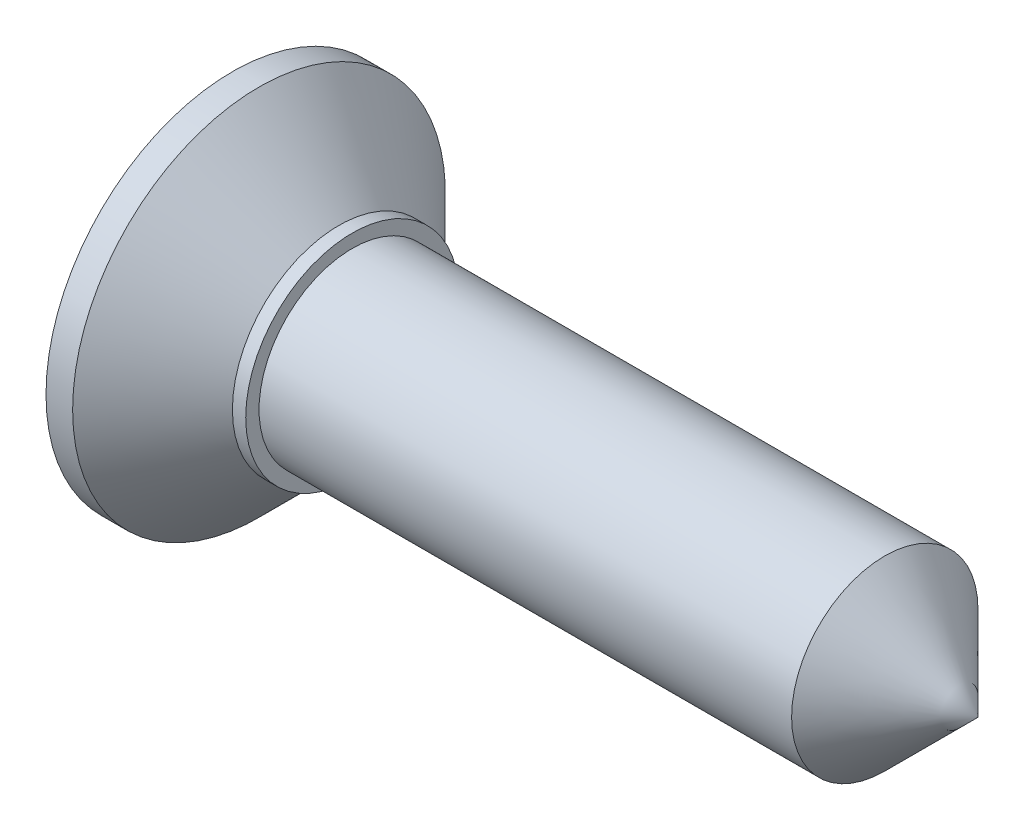
ISO-10303-21;
HEADER;
FILE_DESCRIPTION(('STEP AP214'),'2;1');
FILE_NAME('part.step','',(''),(''),'','','');
FILE_SCHEMA(('AUTOMOTIVE_DESIGN { 1 0 10303 214 1 1 1 1 }'));
ENDSEC;
DATA;
#1=APPLICATION_CONTEXT('core data for automotive mechanical design processes');
#2=APPLICATION_PROTOCOL_DEFINITION('international standard','automotive_design',2000,#1);
#3=PRODUCT_CONTEXT('',#1,'mechanical');
#4=PRODUCT('Part','Part','',(#3));
#5=PRODUCT_RELATED_PRODUCT_CATEGORY('part','',(#4));
#6=PRODUCT_DEFINITION_FORMATION('','',#4);
#7=PRODUCT_DEFINITION_CONTEXT('part definition',#1,'design');
#8=PRODUCT_DEFINITION('design','',#6,#7);
#9=PRODUCT_DEFINITION_SHAPE('','',#8);
#10=(LENGTH_UNIT() NAMED_UNIT(*) SI_UNIT(.MILLI.,.METRE.));
#11=(NAMED_UNIT(*) PLANE_ANGLE_UNIT() SI_UNIT($,.RADIAN.));
#12=(NAMED_UNIT(*) SI_UNIT($,.STERADIAN.) SOLID_ANGLE_UNIT());
#13=UNCERTAINTY_MEASURE_WITH_UNIT(LENGTH_MEASURE(1.E-05),#10,'distance_accuracy_value','');
#14=(GEOMETRIC_REPRESENTATION_CONTEXT(3) GLOBAL_UNCERTAINTY_ASSIGNED_CONTEXT((#13)) GLOBAL_UNIT_ASSIGNED_CONTEXT((#10,
#11,#12)) REPRESENTATION_CONTEXT('',''));
#15=CARTESIAN_POINT('',(0.,0.,0.));
#16=DIRECTION('',(0.,0.,1.));
#17=DIRECTION('',(1.,0.,0.));
#18=AXIS2_PLACEMENT_3D('',#15,#16,#17);
#19=CARTESIAN_POINT('',(2.25,2.,0.));
#20=DIRECTION('',(1.,0.,0.));
#21=DIRECTION('',(0.,0.,-1.));
#22=AXIS2_PLACEMENT_3D('',#19,#20,#21);
#23=PLANE('',#22);
#24=CARTESIAN_POINT('',(2.25,0.,0.));
#25=DIRECTION('',(-1.,0.,0.));
#26=DIRECTION('',(0.,0.,1.));
#27=AXIS2_PLACEMENT_3D('',#24,#25,#26);
#28=CIRCLE('',#27,2.);
#29=CARTESIAN_POINT('',(2.25,0.,2.));
#30=VERTEX_POINT('',#29);
#31=EDGE_CURVE('E11',#30,#30,#28,.T.);
#32=ORIENTED_EDGE('',*,*,#31,.F.);
#33=EDGE_LOOP('',(#32));
#34=FACE_BOUND('',#33,.T.);
#35=CARTESIAN_POINT('',(2.25,0.,0.));
#36=DIRECTION('',(1.,0.,0.));
#37=DIRECTION('',(0.,0.,-1.));
#38=AXIS2_PLACEMENT_3D('',#35,#36,#37);
#39=CIRCLE('',#38,1.75);
#40=CARTESIAN_POINT('',(2.25,0.,-1.75));
#41=VERTEX_POINT('',#40);
#42=EDGE_CURVE('E209',#41,#41,#39,.T.);
#43=ORIENTED_EDGE('',*,*,#42,.F.);
#44=EDGE_LOOP('',(#43));
#45=FACE_BOUND('',#44,.T.);
#46=ADVANCED_FACE('F34',(#34,#45),#23,.T.);
#47=CARTESIAN_POINT('',(2.25,0.,0.));
#48=DIRECTION('',(-1.,0.,0.));
#49=DIRECTION('',(0.,0.,1.));
#50=AXIS2_PLACEMENT_3D('',#47,#48,#49);
#51=CYLINDRICAL_SURFACE('',#50,2.);
#52=ORIENTED_EDGE('',*,*,#31,.T.);
#53=EDGE_LOOP('',(#52));
#54=FACE_BOUND('',#53,.T.);
#55=CARTESIAN_POINT('',(2.,0.,0.));
#56=DIRECTION('',(-1.,0.,0.));
#57=DIRECTION('',(0.,0.,1.));
#58=AXIS2_PLACEMENT_3D('',#55,#56,#57);
#59=CIRCLE('',#58,2.);
#60=CARTESIAN_POINT('',(2.,0.,2.));
#61=VERTEX_POINT('',#60);
#62=EDGE_CURVE('E243',#61,#61,#59,.T.);
#63=ORIENTED_EDGE('',*,*,#62,.F.);
#64=EDGE_LOOP('',(#63));
#65=FACE_BOUND('',#64,.T.);
#66=ADVANCED_FACE('F426',(#54,#65),#51,.T.);
#67=CARTESIAN_POINT('',(0.,0.,0.));
#68=DIRECTION('',(-1.,0.,0.));
#69=DIRECTION('',(0.,0.,1.));
#70=AXIS2_PLACEMENT_3D('',#67,#68,#69);
#71=PLANE('',#70);
#72=DIRECTION('',(0.,0.,1.));
#73=VECTOR('',#72,1.);
#74=CARTESIAN_POINT('',(0.,-0.43,-2.15));
#75=LINE('',#74,#73);
#76=CARTESIAN_POINT('',(0.,-0.43,-2.15));
#77=VERTEX_POINT('',#76);
#78=CARTESIAN_POINT('',(0.,-0.43,-0.605426386469648));
#79=VERTEX_POINT('',#78);
#80=EDGE_CURVE('E53',#77,#79,#75,.T.);
#81=ORIENTED_EDGE('',*,*,#80,.F.);
#82=DIRECTION('',(0.,-1.,0.));
#83=VECTOR('',#82,1.);
#84=CARTESIAN_POINT('',(0.,0.43,-2.15));
#85=LINE('',#84,#83);
#86=CARTESIAN_POINT('',(0.,0.43,-2.15));
#87=VERTEX_POINT('',#86);
#88=EDGE_CURVE('E182',#87,#77,#85,.T.);
#89=ORIENTED_EDGE('',*,*,#88,.F.);
#90=DIRECTION('',(0.,0.,-1.));
#91=VECTOR('',#90,1.);
#92=CARTESIAN_POINT('',(0.,0.43,-0.605426386469649));
#93=LINE('',#92,#91);
#94=CARTESIAN_POINT('',(0.,0.43,-0.605426386469649));
#95=VERTEX_POINT('',#94);
#96=EDGE_CURVE('E192',#95,#87,#93,.T.);
#97=ORIENTED_EDGE('',*,*,#96,.F.);
#98=DIRECTION('',(0.,0.766044443118979,-0.642787609686538));
#99=VECTOR('',#98,1.);
#100=CARTESIAN_POINT('',(0.,-0.120448657835128,-0.143545120698166));
#101=LINE('',#100,#99);
#102=CARTESIAN_POINT('',(0.,1.52027957955106,-1.52027957955106));
#103=VERTEX_POINT('',#102);
#104=EDGE_CURVE('E197',#103,#95,#101,.F.);
#105=ORIENTED_EDGE('',*,*,#104,.F.);
#106=DIRECTION('',(0.,-0.642787609686538,0.766044443118979));
#107=VECTOR('',#106,1.);
#108=CARTESIAN_POINT('',(0.,0.143545120698164,0.120448657835128));
#109=LINE('',#108,#107);
#110=CARTESIAN_POINT('',(0.,0.605426386469648,-0.43));
#111=VERTEX_POINT('',#110);
#112=EDGE_CURVE('E296',#111,#103,#109,.F.);
#113=ORIENTED_EDGE('',*,*,#112,.F.);
#114=DIRECTION('',(0.,-1.,0.));
#115=VECTOR('',#114,1.);
#116=CARTESIAN_POINT('',(0.,2.15,-0.43));
#117=LINE('',#116,#115);
#118=CARTESIAN_POINT('',(0.,2.15,-0.43));
#119=VERTEX_POINT('',#118);
#120=EDGE_CURVE('E299',#119,#111,#117,.T.);
#121=ORIENTED_EDGE('',*,*,#120,.F.);
#122=DIRECTION('',(0.,0.,-1.));
#123=VECTOR('',#122,1.);
#124=CARTESIAN_POINT('',(0.,2.15,0.43));
#125=LINE('',#124,#123);
#126=CARTESIAN_POINT('',(0.,2.15,0.43));
#127=VERTEX_POINT('',#126);
#128=EDGE_CURVE('E363',#127,#119,#125,.T.);
#129=ORIENTED_EDGE('',*,*,#128,.F.);
#130=DIRECTION('',(0.,1.,0.));
#131=VECTOR('',#130,1.);
#132=CARTESIAN_POINT('',(0.,0.605426386469649,0.43));
#133=LINE('',#132,#131);
#134=CARTESIAN_POINT('',(0.,0.605426386469649,0.43));
#135=VERTEX_POINT('',#134);
#136=EDGE_CURVE('E291',#135,#127,#133,.T.);
#137=ORIENTED_EDGE('',*,*,#136,.F.);
#138=DIRECTION('',(0.,0.642787609686538,0.766044443118979));
#139=VECTOR('',#138,1.);
#140=CARTESIAN_POINT('',(0.,0.143545120698166,-0.120448657835128));
#141=LINE('',#140,#139);
#142=CARTESIAN_POINT('',(0.,1.52027957955106,1.52027957955106));
#143=VERTEX_POINT('',#142);
#144=EDGE_CURVE('E282',#143,#135,#141,.F.);
#145=ORIENTED_EDGE('',*,*,#144,.F.);
#146=DIRECTION('',(0.,-0.766044443118979,-0.642787609686538));
#147=VECTOR('',#146,1.);
#148=CARTESIAN_POINT('',(0.,-0.120448657835128,0.143545120698164));
#149=LINE('',#148,#147);
#150=CARTESIAN_POINT('',(0.,0.43,0.605426386469648));
#151=VERTEX_POINT('',#150);
#152=EDGE_CURVE('E279',#151,#143,#149,.F.);
#153=ORIENTED_EDGE('',*,*,#152,.F.);
#154=DIRECTION('',(0.,0.,-1.));
#155=VECTOR('',#154,1.);
#156=CARTESIAN_POINT('',(0.,0.43,2.15));
#157=LINE('',#156,#155);
#158=CARTESIAN_POINT('',(0.,0.43,2.15));
#159=VERTEX_POINT('',#158);
#160=EDGE_CURVE('E283',#159,#151,#157,.T.);
#161=ORIENTED_EDGE('',*,*,#160,.F.);
#162=DIRECTION('',(0.,1.,0.));
#163=VECTOR('',#162,1.);
#164=CARTESIAN_POINT('',(0.,-0.43,2.15));
#165=LINE('',#164,#163);
#166=CARTESIAN_POINT('',(0.,-0.43,2.15));
#167=VERTEX_POINT('',#166);
#168=EDGE_CURVE('E356',#167,#159,#165,.T.);
#169=ORIENTED_EDGE('',*,*,#168,.F.);
#170=DIRECTION('',(0.,0.,1.));
#171=VECTOR('',#170,1.);
#172=CARTESIAN_POINT('',(0.,-0.429999999999999,0.605426386469648));
#173=LINE('',#172,#171);
#174=CARTESIAN_POINT('',(0.,-0.429999999999999,0.605426386469648));
#175=VERTEX_POINT('',#174);
#176=EDGE_CURVE('E274',#175,#167,#173,.T.);
#177=ORIENTED_EDGE('',*,*,#176,.F.);
#178=DIRECTION('',(0.,-0.76604444311898,0.642787609686537));
#179=VECTOR('',#178,1.);
#180=CARTESIAN_POINT('',(0.,0.120448657835128,0.143545120698166));
#181=LINE('',#180,#179);
#182=CARTESIAN_POINT('',(0.,-1.52027957955106,1.52027957955105));
#183=VERTEX_POINT('',#182);
#184=EDGE_CURVE('E265',#183,#175,#181,.F.);
#185=ORIENTED_EDGE('',*,*,#184,.F.);
#186=DIRECTION('',(0.,0.642787609686539,-0.766044443118979));
#187=VECTOR('',#186,1.);
#188=CARTESIAN_POINT('',(0.,-0.143545120698164,-0.120448657835128));
#189=LINE('',#188,#187);
#190=CARTESIAN_POINT('',(0.,-0.605426386469648,0.43));
#191=VERTEX_POINT('',#190);
#192=EDGE_CURVE('E262',#191,#183,#189,.F.);
#193=ORIENTED_EDGE('',*,*,#192,.F.);
#194=DIRECTION('',(0.,1.,0.));
#195=VECTOR('',#194,1.);
#196=CARTESIAN_POINT('',(0.,-2.15,0.43));
#197=LINE('',#196,#195);
#198=CARTESIAN_POINT('',(0.,-2.15,0.43));
#199=VERTEX_POINT('',#198);
#200=EDGE_CURVE('E266',#199,#191,#197,.T.);
#201=ORIENTED_EDGE('',*,*,#200,.F.);
#202=DIRECTION('',(0.,0.,1.));
#203=VECTOR('',#202,1.);
#204=CARTESIAN_POINT('',(0.,-2.15,-0.43));
#205=LINE('',#204,#203);
#206=CARTESIAN_POINT('',(0.,-2.15,-0.43));
#207=VERTEX_POINT('',#206);
#208=EDGE_CURVE('E349',#207,#199,#205,.T.);
#209=ORIENTED_EDGE('',*,*,#208,.F.);
#210=DIRECTION('',(0.,-1.,0.));
#211=VECTOR('',#210,1.);
#212=CARTESIAN_POINT('',(0.,-0.605426386469649,-0.43));
#213=LINE('',#212,#211);
#214=CARTESIAN_POINT('',(0.,-0.605426386469649,-0.43));
#215=VERTEX_POINT('',#214);
#216=EDGE_CURVE('E256',#215,#207,#213,.T.);
#217=ORIENTED_EDGE('',*,*,#216,.F.);
#218=DIRECTION('',(0.,-0.642787609686538,-0.766044443118979));
#219=VECTOR('',#218,1.);
#220=CARTESIAN_POINT('',(0.,-0.143545120698166,0.120448657835128));
#221=LINE('',#220,#219);
#222=CARTESIAN_POINT('',(0.,-1.52027957955106,-1.52027957955106));
#223=VERTEX_POINT('',#222);
#224=EDGE_CURVE('E253',#223,#215,#221,.F.);
#225=ORIENTED_EDGE('',*,*,#224,.F.);
#226=DIRECTION('',(0.,0.766044443118979,0.642787609686538));
#227=VECTOR('',#226,1.);
#228=CARTESIAN_POINT('',(0.,0.120448657835128,-0.143545120698164));
#229=LINE('',#228,#227);
#230=EDGE_CURVE('E257',#79,#223,#229,.F.);
#231=ORIENTED_EDGE('',*,*,#230,.F.);
#232=EDGE_LOOP('',(#81,#89,#97,#105,#113,#121,#129,#137,#145,#153,#161,#169,#177,#185,#193,#201,
#209,#217,#225,#231));
#233=FACE_BOUND('',#232,.T.);
#234=CARTESIAN_POINT('',(0.,0.,0.));
#235=DIRECTION('',(-1.,0.,0.));
#236=DIRECTION('',(0.,0.,1.));
#237=AXIS2_PLACEMENT_3D('',#234,#235,#236);
#238=CIRCLE('',#237,3.49999999999295);
#239=CARTESIAN_POINT('',(0.,0.,3.49999999999295));
#240=VERTEX_POINT('',#239);
#241=EDGE_CURVE('E44',#240,#240,#238,.T.);
#242=ORIENTED_EDGE('',*,*,#241,.T.);
#243=EDGE_LOOP('',(#242));
#244=FACE_BOUND('',#243,.T.);
#245=ADVANCED_FACE('F199',(#233,#244),#71,.T.);
#246=CARTESIAN_POINT('',(2.25,0.,0.));
#247=DIRECTION('',(-1.,0.,0.));
#248=DIRECTION('',(0.,0.,1.));
#249=AXIS2_PLACEMENT_3D('',#246,#247,#248);
#250=CYLINDRICAL_SURFACE('',#249,3.49999999999295);
#251=CARTESIAN_POINT('',(0.500000000007049,0.,0.));
#252=DIRECTION('',(-1.,0.,0.));
#253=DIRECTION('',(0.,0.,1.));
#254=AXIS2_PLACEMENT_3D('',#251,#252,#253);
#255=CIRCLE('',#254,3.49999999999295);
#256=CARTESIAN_POINT('',(0.500000000007049,0.,3.49999999999295));
#257=VERTEX_POINT('',#256);
#258=EDGE_CURVE('E248',#257,#257,#255,.T.);
#259=ORIENTED_EDGE('',*,*,#258,.T.);
#260=EDGE_LOOP('',(#259));
#261=FACE_BOUND('',#260,.T.);
#262=ORIENTED_EDGE('',*,*,#241,.F.);
#263=EDGE_LOOP('',(#262));
#264=FACE_BOUND('',#263,.T.);
#265=ADVANCED_FACE('F531',(#261,#264),#250,.T.);
#266=CARTESIAN_POINT('',(0.500000000007049,0.,0.));
#267=DIRECTION('',(-1.,0.,0.));
#268=DIRECTION('',(0.,0.,1.));
#269=AXIS2_PLACEMENT_3D('',#266,#267,#268);
#270=CONICAL_SURFACE('',#269,3.49999999999295,0.785398163397448);
#271=ORIENTED_EDGE('',*,*,#62,.T.);
#272=EDGE_LOOP('',(#271));
#273=FACE_BOUND('',#272,.T.);
#274=ORIENTED_EDGE('',*,*,#258,.F.);
#275=EDGE_LOOP('',(#274));
#276=FACE_BOUND('',#275,.T.);
#277=ADVANCED_FACE('F607',(#273,#276),#270,.T.);
#278=CARTESIAN_POINT('',(12.25,0.,0.));
#279=DIRECTION('',(-1.,0.,0.));
#280=DIRECTION('',(0.,0.,1.));
#281=AXIS2_PLACEMENT_3D('',#278,#279,#280);
#282=CYLINDRICAL_SURFACE('',#281,1.75);
#283=CARTESIAN_POINT('',(12.25,0.,0.));
#284=DIRECTION('',(1.,0.,0.));
#285=DIRECTION('',(0.,0.,-1.));
#286=AXIS2_PLACEMENT_3D('',#283,#284,#285);
#287=CIRCLE('',#286,1.75);
#288=CARTESIAN_POINT('',(12.25,0.,-1.75));
#289=VERTEX_POINT('',#288);
#290=EDGE_CURVE('E240',#289,#289,#287,.T.);
#291=ORIENTED_EDGE('',*,*,#290,.F.);
#292=EDGE_LOOP('',(#291));
#293=FACE_BOUND('',#292,.T.);
#294=ORIENTED_EDGE('',*,*,#42,.T.);
#295=EDGE_LOOP('',(#294));
#296=FACE_BOUND('',#295,.T.);
#297=ADVANCED_FACE('F598',(#293,#296),#282,.T.);
#298=CARTESIAN_POINT('',(14.,0.,0.));
#299=DIRECTION('',(-1.,0.,0.));
#300=DIRECTION('',(0.,0.,1.));
#301=AXIS2_PLACEMENT_3D('',#298,#299,#300);
#302=CONICAL_SURFACE('',#301,0.,0.785398163390066);
#303=ORIENTED_EDGE('',*,*,#290,.T.);
#304=EDGE_LOOP('',(#303));
#305=FACE_BOUND('',#304,.T.);
#306=CARTESIAN_POINT('',(14.,0.,0.));
#307=VERTEX_POINT('',#306);
#308=VERTEX_LOOP('',#307);
#309=FACE_BOUND('',#308,.T.);
#310=ADVANCED_FACE('F589',(#305,#309),#302,.T.);
#311=CARTESIAN_POINT('',(1.,-0.43,-2.15));
#312=DIRECTION('',(0.,-1.,0.));
#313=DIRECTION('',(0.,0.,-1.));
#314=AXIS2_PLACEMENT_3D('',#311,#312,#313);
#315=PLANE('',#314);
#316=ORIENTED_EDGE('',*,*,#80,.T.);
#317=DIRECTION('',(-1.,0.,0.));
#318=VECTOR('',#317,1.);
#319=CARTESIAN_POINT('',(1.,-0.43,-0.605426386469648));
#320=LINE('',#319,#318);
#321=CARTESIAN_POINT('',(1.,-0.43,-0.605426386469648));
#322=VERTEX_POINT('',#321);
#323=EDGE_CURVE('E104',#322,#79,#320,.T.);
#324=ORIENTED_EDGE('',*,*,#323,.F.);
#325=DIRECTION('',(0.,0.,1.));
#326=VECTOR('',#325,1.);
#327=CARTESIAN_POINT('',(1.,-0.43,-2.15));
#328=LINE('',#327,#326);
#329=CARTESIAN_POINT('',(1.,-0.43,-2.15));
#330=VERTEX_POINT('',#329);
#331=EDGE_CURVE('E202',#330,#322,#328,.T.);
#332=ORIENTED_EDGE('',*,*,#331,.F.);
#333=DIRECTION('',(-1.,0.,0.));
#334=VECTOR('',#333,1.);
#335=CARTESIAN_POINT('',(1.,-0.43,-2.15));
#336=LINE('',#335,#334);
#337=EDGE_CURVE('E188',#330,#77,#336,.T.);
#338=ORIENTED_EDGE('',*,*,#337,.T.);
#339=EDGE_LOOP('',(#316,#324,#332,#338));
#340=FACE_BOUND('',#339,.T.);
#341=ADVANCED_FACE('F460',(#340),#315,.F.);
#342=CARTESIAN_POINT('',(1.,0.43,-2.15));
#343=DIRECTION('',(0.,0.,-1.));
#344=DIRECTION('',(-1.,0.,0.));
#345=AXIS2_PLACEMENT_3D('',#342,#343,#344);
#346=PLANE('',#345);
#347=ORIENTED_EDGE('',*,*,#88,.T.);
#348=ORIENTED_EDGE('',*,*,#337,.F.);
#349=DIRECTION('',(0.,-1.,0.));
#350=VECTOR('',#349,1.);
#351=CARTESIAN_POINT('',(1.,0.43,-2.15));
#352=LINE('',#351,#350);
#353=CARTESIAN_POINT('',(1.,0.43,-2.15));
#354=VERTEX_POINT('',#353);
#355=EDGE_CURVE('E184',#354,#330,#352,.T.);
#356=ORIENTED_EDGE('',*,*,#355,.F.);
#357=DIRECTION('',(-1.,0.,0.));
#358=VECTOR('',#357,1.);
#359=CARTESIAN_POINT('',(1.,0.43,-2.15));
#360=LINE('',#359,#358);
#361=EDGE_CURVE('E178',#354,#87,#360,.T.);
#362=ORIENTED_EDGE('',*,*,#361,.T.);
#363=EDGE_LOOP('',(#347,#348,#356,#362));
#364=FACE_BOUND('',#363,.T.);
#365=ADVANCED_FACE('F180',(#364),#346,.F.);
#366=CARTESIAN_POINT('',(1.,0.43,-0.605426386469649));
#367=DIRECTION('',(0.,1.,0.));
#368=DIRECTION('',(0.,0.,1.));
#369=AXIS2_PLACEMENT_3D('',#366,#367,#368);
#370=PLANE('',#369);
#371=ORIENTED_EDGE('',*,*,#96,.T.);
#372=ORIENTED_EDGE('',*,*,#361,.F.);
#373=DIRECTION('',(0.,0.,-1.));
#374=VECTOR('',#373,1.);
#375=CARTESIAN_POINT('',(1.,0.43,-0.605426386469649));
#376=LINE('',#375,#374);
#377=CARTESIAN_POINT('',(1.,0.43,-0.605426386469649));
#378=VERTEX_POINT('',#377);
#379=EDGE_CURVE('E309',#378,#354,#376,.T.);
#380=ORIENTED_EDGE('',*,*,#379,.F.);
#381=DIRECTION('',(-1.,0.,0.));
#382=VECTOR('',#381,1.);
#383=CARTESIAN_POINT('',(1.,0.43,-0.605426386469649));
#384=LINE('',#383,#382);
#385=EDGE_CURVE('E189',#378,#95,#384,.T.);
#386=ORIENTED_EDGE('',*,*,#385,.T.);
#387=EDGE_LOOP('',(#371,#372,#380,#386));
#388=FACE_BOUND('',#387,.T.);
#389=ADVANCED_FACE('F193',(#388),#370,.F.);
#390=CARTESIAN_POINT('',(1.,0.43,-0.605426386469649));
#391=DIRECTION('',(0.,0.642787609686538,0.766044443118979));
#392=DIRECTION('',(0.,-0.766044443118979,0.642787609686538));
#393=AXIS2_PLACEMENT_3D('',#390,#391,#392);
#394=PLANE('',#393);
#395=ORIENTED_EDGE('',*,*,#104,.T.);
#396=ORIENTED_EDGE('',*,*,#385,.F.);
#397=DIRECTION('',(0.,0.766044443118979,-0.642787609686538));
#398=VECTOR('',#397,1.);
#399=CARTESIAN_POINT('',(1.,0.43,-0.605426386469649));
#400=LINE('',#399,#398);
#401=CARTESIAN_POINT('',(1.,1.52027957955106,-1.52027957955106));
#402=VERTEX_POINT('',#401);
#403=EDGE_CURVE('E303',#402,#378,#400,.F.);
#404=ORIENTED_EDGE('',*,*,#403,.F.);
#405=DIRECTION('',(-1.,0.,0.));
#406=VECTOR('',#405,1.);
#407=CARTESIAN_POINT('',(1.,1.52027957955106,-1.52027957955106));
#408=LINE('',#407,#406);
#409=EDGE_CURVE('E212',#402,#103,#408,.T.);
#410=ORIENTED_EDGE('',*,*,#409,.T.);
#411=EDGE_LOOP('',(#395,#396,#404,#410));
#412=FACE_BOUND('',#411,.T.);
#413=ADVANCED_FACE('F450',(#412),#394,.T.);
#414=CARTESIAN_POINT('',(1.,0.605426386469648,-0.43));
#415=DIRECTION('',(0.,-0.766044443118979,-0.642787609686538));
#416=DIRECTION('',(0.,0.642787609686538,-0.766044443118979));
#417=AXIS2_PLACEMENT_3D('',#414,#415,#416);
#418=PLANE('',#417);
#419=ORIENTED_EDGE('',*,*,#112,.T.);
#420=ORIENTED_EDGE('',*,*,#409,.F.);
#421=DIRECTION('',(0.,-0.642787609686538,0.766044443118979));
#422=VECTOR('',#421,1.);
#423=CARTESIAN_POINT('',(1.,0.605426386469648,-0.43));
#424=LINE('',#423,#422);
#425=CARTESIAN_POINT('',(1.,0.605426386469648,-0.43));
#426=VERTEX_POINT('',#425);
#427=EDGE_CURVE('E300',#426,#402,#424,.F.);
#428=ORIENTED_EDGE('',*,*,#427,.F.);
#429=DIRECTION('',(-1.,0.,0.));
#430=VECTOR('',#429,1.);
#431=CARTESIAN_POINT('',(1.,0.605426386469648,-0.43));
#432=LINE('',#431,#430);
#433=EDGE_CURVE('E213',#426,#111,#432,.T.);
#434=ORIENTED_EDGE('',*,*,#433,.T.);
#435=EDGE_LOOP('',(#419,#420,#428,#434));
#436=FACE_BOUND('',#435,.T.);
#437=ADVANCED_FACE('F374',(#436),#418,.T.);
#438=CARTESIAN_POINT('',(1.,2.15,-0.43));
#439=DIRECTION('',(0.,0.,-1.));
#440=DIRECTION('',(0.,1.,0.));
#441=AXIS2_PLACEMENT_3D('',#438,#439,#440);
#442=PLANE('',#441);
#443=ORIENTED_EDGE('',*,*,#120,.T.);
#444=ORIENTED_EDGE('',*,*,#433,.F.);
#445=DIRECTION('',(0.,-1.,0.));
#446=VECTOR('',#445,1.);
#447=CARTESIAN_POINT('',(1.,2.15,-0.43));
#448=LINE('',#447,#446);
#449=CARTESIAN_POINT('',(1.,2.15,-0.43));
#450=VERTEX_POINT('',#449);
#451=EDGE_CURVE('E304',#450,#426,#448,.T.);
#452=ORIENTED_EDGE('',*,*,#451,.F.);
#453=DIRECTION('',(-1.,0.,0.));
#454=VECTOR('',#453,1.);
#455=CARTESIAN_POINT('',(1.,2.15,-0.43));
#456=LINE('',#455,#454);
#457=EDGE_CURVE('E215',#450,#119,#456,.T.);
#458=ORIENTED_EDGE('',*,*,#457,.T.);
#459=EDGE_LOOP('',(#443,#444,#452,#458));
#460=FACE_BOUND('',#459,.T.);
#461=ADVANCED_FACE('F369',(#460),#442,.F.);
#462=CARTESIAN_POINT('',(1.,2.15,0.43));
#463=DIRECTION('',(0.,1.,0.));
#464=DIRECTION('',(0.,0.,1.));
#465=AXIS2_PLACEMENT_3D('',#462,#463,#464);
#466=PLANE('',#465);
#467=ORIENTED_EDGE('',*,*,#128,.T.);
#468=ORIENTED_EDGE('',*,*,#457,.F.);
#469=DIRECTION('',(0.,0.,-1.));
#470=VECTOR('',#469,1.);
#471=CARTESIAN_POINT('',(1.,2.15,0.43));
#472=LINE('',#471,#470);
#473=CARTESIAN_POINT('',(1.,2.15,0.43));
#474=VERTEX_POINT('',#473);
#475=EDGE_CURVE('E340',#474,#450,#472,.T.);
#476=ORIENTED_EDGE('',*,*,#475,.F.);
#477=DIRECTION('',(-1.,0.,0.));
#478=VECTOR('',#477,1.);
#479=CARTESIAN_POINT('',(1.,2.15,0.43));
#480=LINE('',#479,#478);
#481=EDGE_CURVE('E217',#474,#127,#480,.T.);
#482=ORIENTED_EDGE('',*,*,#481,.T.);
#483=EDGE_LOOP('',(#467,#468,#476,#482));
#484=FACE_BOUND('',#483,.T.);
#485=ADVANCED_FACE('F379',(#484),#466,.F.);
#486=CARTESIAN_POINT('',(1.,0.605426386469649,0.43));
#487=DIRECTION('',(0.,0.,1.));
#488=DIRECTION('',(0.,-1.,0.));
#489=AXIS2_PLACEMENT_3D('',#486,#487,#488);
#490=PLANE('',#489);
#491=ORIENTED_EDGE('',*,*,#136,.T.);
#492=ORIENTED_EDGE('',*,*,#481,.F.);
#493=DIRECTION('',(0.,1.,0.));
#494=VECTOR('',#493,1.);
#495=CARTESIAN_POINT('',(1.,0.605426386469649,0.43));
#496=LINE('',#495,#494);
#497=CARTESIAN_POINT('',(1.,0.605426386469649,0.43));
#498=VERTEX_POINT('',#497);
#499=EDGE_CURVE('E295',#498,#474,#496,.T.);
#500=ORIENTED_EDGE('',*,*,#499,.F.);
#501=DIRECTION('',(-1.,0.,0.));
#502=VECTOR('',#501,1.);
#503=CARTESIAN_POINT('',(1.,0.605426386469649,0.43));
#504=LINE('',#503,#502);
#505=EDGE_CURVE('E219',#498,#135,#504,.T.);
#506=ORIENTED_EDGE('',*,*,#505,.T.);
#507=EDGE_LOOP('',(#491,#492,#500,#506));
#508=FACE_BOUND('',#507,.T.);
#509=ADVANCED_FACE('F384',(#508),#490,.F.);
#510=CARTESIAN_POINT('',(1.,0.605426386469649,0.43));
#511=DIRECTION('',(0.,-0.766044443118979,0.642787609686538));
#512=DIRECTION('',(0.,-0.642787609686538,-0.766044443118979));
#513=AXIS2_PLACEMENT_3D('',#510,#511,#512);
#514=PLANE('',#513);
#515=ORIENTED_EDGE('',*,*,#144,.T.);
#516=ORIENTED_EDGE('',*,*,#505,.F.);
#517=DIRECTION('',(0.,0.642787609686538,0.766044443118979));
#518=VECTOR('',#517,1.);
#519=CARTESIAN_POINT('',(1.,0.605426386469649,0.43));
#520=LINE('',#519,#518);
#521=CARTESIAN_POINT('',(1.,1.52027957955106,1.52027957955106));
#522=VERTEX_POINT('',#521);
#523=EDGE_CURVE('E287',#522,#498,#520,.F.);
#524=ORIENTED_EDGE('',*,*,#523,.F.);
#525=DIRECTION('',(-1.,0.,0.));
#526=VECTOR('',#525,1.);
#527=CARTESIAN_POINT('',(1.,1.52027957955106,1.52027957955106));
#528=LINE('',#527,#526);
#529=EDGE_CURVE('E221',#522,#143,#528,.T.);
#530=ORIENTED_EDGE('',*,*,#529,.T.);
#531=EDGE_LOOP('',(#515,#516,#524,#530));
#532=FACE_BOUND('',#531,.T.);
#533=ADVANCED_FACE('F387',(#532),#514,.T.);
#534=CARTESIAN_POINT('',(1.,0.43,0.605426386469648));
#535=DIRECTION('',(0.,0.642787609686538,-0.766044443118979));
#536=DIRECTION('',(0.,0.766044443118979,0.642787609686538));
#537=AXIS2_PLACEMENT_3D('',#534,#535,#536);
#538=PLANE('',#537);
#539=ORIENTED_EDGE('',*,*,#152,.T.);
#540=ORIENTED_EDGE('',*,*,#529,.F.);
#541=DIRECTION('',(0.,-0.766044443118979,-0.642787609686538));
#542=VECTOR('',#541,1.);
#543=CARTESIAN_POINT('',(1.,0.43,0.605426386469648));
#544=LINE('',#543,#542);
#545=CARTESIAN_POINT('',(1.,0.43,0.605426386469648));
#546=VERTEX_POINT('',#545);
#547=EDGE_CURVE('E284',#546,#522,#544,.F.);
#548=ORIENTED_EDGE('',*,*,#547,.F.);
#549=DIRECTION('',(-1.,0.,0.));
#550=VECTOR('',#549,1.);
#551=CARTESIAN_POINT('',(1.,0.43,0.605426386469648));
#552=LINE('',#551,#550);
#553=EDGE_CURVE('E222',#546,#151,#552,.T.);
#554=ORIENTED_EDGE('',*,*,#553,.T.);
#555=EDGE_LOOP('',(#539,#540,#548,#554));
#556=FACE_BOUND('',#555,.T.);
#557=ADVANCED_FACE('F390',(#556),#538,.T.);
#558=CARTESIAN_POINT('',(1.,0.43,2.15));
#559=DIRECTION('',(0.,1.,0.));
#560=DIRECTION('',(0.,0.,1.));
#561=AXIS2_PLACEMENT_3D('',#558,#559,#560);
#562=PLANE('',#561);
#563=ORIENTED_EDGE('',*,*,#160,.T.);
#564=ORIENTED_EDGE('',*,*,#553,.F.);
#565=DIRECTION('',(0.,0.,-1.));
#566=VECTOR('',#565,1.);
#567=CARTESIAN_POINT('',(1.,0.43,2.15));
#568=LINE('',#567,#566);
#569=CARTESIAN_POINT('',(1.,0.43,2.15));
#570=VERTEX_POINT('',#569);
#571=EDGE_CURVE('E288',#570,#546,#568,.T.);
#572=ORIENTED_EDGE('',*,*,#571,.F.);
#573=DIRECTION('',(-1.,0.,0.));
#574=VECTOR('',#573,1.);
#575=CARTESIAN_POINT('',(1.,0.43,2.15));
#576=LINE('',#575,#574);
#577=EDGE_CURVE('E224',#570,#159,#576,.T.);
#578=ORIENTED_EDGE('',*,*,#577,.T.);
#579=EDGE_LOOP('',(#563,#564,#572,#578));
#580=FACE_BOUND('',#579,.T.);
#581=ADVANCED_FACE('F395',(#580),#562,.F.);
#582=CARTESIAN_POINT('',(1.,-0.43,2.15));
#583=DIRECTION('',(0.,0.,1.));
#584=DIRECTION('',(1.,0.,0.));
#585=AXIS2_PLACEMENT_3D('',#582,#583,#584);
#586=PLANE('',#585);
#587=ORIENTED_EDGE('',*,*,#168,.T.);
#588=ORIENTED_EDGE('',*,*,#577,.F.);
#589=DIRECTION('',(0.,1.,0.));
#590=VECTOR('',#589,1.);
#591=CARTESIAN_POINT('',(1.,-0.43,2.15));
#592=LINE('',#591,#590);
#593=CARTESIAN_POINT('',(1.,-0.43,2.15));
#594=VERTEX_POINT('',#593);
#595=EDGE_CURVE('E333',#594,#570,#592,.T.);
#596=ORIENTED_EDGE('',*,*,#595,.F.);
#597=DIRECTION('',(-1.,0.,0.));
#598=VECTOR('',#597,1.);
#599=CARTESIAN_POINT('',(1.,-0.43,2.15));
#600=LINE('',#599,#598);
#601=EDGE_CURVE('E226',#594,#167,#600,.T.);
#602=ORIENTED_EDGE('',*,*,#601,.T.);
#603=EDGE_LOOP('',(#587,#588,#596,#602));
#604=FACE_BOUND('',#603,.T.);
#605=ADVANCED_FACE('F399',(#604),#586,.F.);
#606=CARTESIAN_POINT('',(1.,-0.429999999999999,0.605426386469648));
#607=DIRECTION('',(0.,-1.,0.));
#608=DIRECTION('',(0.,0.,-1.));
#609=AXIS2_PLACEMENT_3D('',#606,#607,#608);
#610=PLANE('',#609);
#611=ORIENTED_EDGE('',*,*,#176,.T.);
#612=ORIENTED_EDGE('',*,*,#601,.F.);
#613=DIRECTION('',(0.,0.,1.));
#614=VECTOR('',#613,1.);
#615=CARTESIAN_POINT('',(1.,-0.429999999999999,0.605426386469648));
#616=LINE('',#615,#614);
#617=CARTESIAN_POINT('',(1.,-0.429999999999999,0.605426386469648));
#618=VERTEX_POINT('',#617);
#619=EDGE_CURVE('E278',#618,#594,#616,.T.);
#620=ORIENTED_EDGE('',*,*,#619,.F.);
#621=DIRECTION('',(-1.,0.,0.));
#622=VECTOR('',#621,1.);
#623=CARTESIAN_POINT('',(1.,-0.429999999999999,0.605426386469648));
#624=LINE('',#623,#622);
#625=EDGE_CURVE('E228',#618,#175,#624,.T.);
#626=ORIENTED_EDGE('',*,*,#625,.T.);
#627=EDGE_LOOP('',(#611,#612,#620,#626));
#628=FACE_BOUND('',#627,.T.);
#629=ADVANCED_FACE('F402',(#628),#610,.F.);
#630=CARTESIAN_POINT('',(1.,-0.429999999999999,0.605426386469648));
#631=DIRECTION('',(0.,-0.642787609686537,-0.76604444311898));
#632=DIRECTION('',(0.,0.76604444311898,-0.642787609686537));
#633=AXIS2_PLACEMENT_3D('',#630,#631,#632);
#634=PLANE('',#633);
#635=ORIENTED_EDGE('',*,*,#184,.T.);
#636=ORIENTED_EDGE('',*,*,#625,.F.);
#637=DIRECTION('',(0.,-0.76604444311898,0.642787609686537));
#638=VECTOR('',#637,1.);
#639=CARTESIAN_POINT('',(1.,-0.429999999999999,0.605426386469648));
#640=LINE('',#639,#638);
#641=CARTESIAN_POINT('',(1.,-1.52027957955106,1.52027957955105));
#642=VERTEX_POINT('',#641);
#643=EDGE_CURVE('E270',#642,#618,#640,.F.);
#644=ORIENTED_EDGE('',*,*,#643,.F.);
#645=DIRECTION('',(-1.,0.,0.));
#646=VECTOR('',#645,1.);
#647=CARTESIAN_POINT('',(1.,-1.52027957955106,1.52027957955106));
#648=LINE('',#647,#646);
#649=EDGE_CURVE('E230',#642,#183,#648,.T.);
#650=ORIENTED_EDGE('',*,*,#649,.T.);
#651=EDGE_LOOP('',(#635,#636,#644,#650));
#652=FACE_BOUND('',#651,.T.);
#653=ADVANCED_FACE('F407',(#652),#634,.T.);
#654=CARTESIAN_POINT('',(1.,-0.605426386469648,0.43));
#655=DIRECTION('',(0.,0.766044443118979,0.642787609686538));
#656=DIRECTION('',(0.,-0.642787609686539,0.766044443118979));
#657=AXIS2_PLACEMENT_3D('',#654,#655,#656);
#658=PLANE('',#657);
#659=ORIENTED_EDGE('',*,*,#192,.T.);
#660=ORIENTED_EDGE('',*,*,#649,.F.);
#661=DIRECTION('',(0.,0.642787609686539,-0.766044443118979));
#662=VECTOR('',#661,1.);
#663=CARTESIAN_POINT('',(1.,-0.605426386469648,0.43));
#664=LINE('',#663,#662);
#665=CARTESIAN_POINT('',(1.,-0.605426386469648,0.43));
#666=VERTEX_POINT('',#665);
#667=EDGE_CURVE('E267',#666,#642,#664,.F.);
#668=ORIENTED_EDGE('',*,*,#667,.F.);
#669=DIRECTION('',(-1.,0.,0.));
#670=VECTOR('',#669,1.);
#671=CARTESIAN_POINT('',(1.,-0.605426386469648,0.43));
#672=LINE('',#671,#670);
#673=EDGE_CURVE('E231',#666,#191,#672,.T.);
#674=ORIENTED_EDGE('',*,*,#673,.T.);
#675=EDGE_LOOP('',(#659,#660,#668,#674));
#676=FACE_BOUND('',#675,.T.);
#677=ADVANCED_FACE('F411',(#676),#658,.T.);
#678=CARTESIAN_POINT('',(1.,-2.15,0.43));
#679=DIRECTION('',(0.,0.,1.));
#680=DIRECTION('',(0.,-1.,0.));
#681=AXIS2_PLACEMENT_3D('',#678,#679,#680);
#682=PLANE('',#681);
#683=ORIENTED_EDGE('',*,*,#200,.T.);
#684=ORIENTED_EDGE('',*,*,#673,.F.);
#685=DIRECTION('',(0.,1.,0.));
#686=VECTOR('',#685,1.);
#687=CARTESIAN_POINT('',(1.,-2.15,0.43));
#688=LINE('',#687,#686);
#689=CARTESIAN_POINT('',(1.,-2.15,0.43));
#690=VERTEX_POINT('',#689);
#691=EDGE_CURVE('E271',#690,#666,#688,.T.);
#692=ORIENTED_EDGE('',*,*,#691,.F.);
#693=DIRECTION('',(-1.,0.,0.));
#694=VECTOR('',#693,1.);
#695=CARTESIAN_POINT('',(1.,-2.15,0.43));
#696=LINE('',#695,#694);
#697=EDGE_CURVE('E233',#690,#199,#696,.T.);
#698=ORIENTED_EDGE('',*,*,#697,.T.);
#699=EDGE_LOOP('',(#683,#684,#692,#698));
#700=FACE_BOUND('',#699,.T.);
#701=ADVANCED_FACE('F414',(#700),#682,.F.);
#702=CARTESIAN_POINT('',(1.,-2.15,-0.43));
#703=DIRECTION('',(0.,-1.,0.));
#704=DIRECTION('',(0.,0.,-1.));
#705=AXIS2_PLACEMENT_3D('',#702,#703,#704);
#706=PLANE('',#705);
#707=ORIENTED_EDGE('',*,*,#208,.T.);
#708=ORIENTED_EDGE('',*,*,#697,.F.);
#709=DIRECTION('',(0.,0.,1.));
#710=VECTOR('',#709,1.);
#711=CARTESIAN_POINT('',(1.,-2.15,-0.43));
#712=LINE('',#711,#710);
#713=CARTESIAN_POINT('',(1.,-2.15,-0.43));
#714=VERTEX_POINT('',#713);
#715=EDGE_CURVE('E325',#714,#690,#712,.T.);
#716=ORIENTED_EDGE('',*,*,#715,.F.);
#717=DIRECTION('',(-1.,0.,0.));
#718=VECTOR('',#717,1.);
#719=CARTESIAN_POINT('',(1.,-2.15,-0.43));
#720=LINE('',#719,#718);
#721=EDGE_CURVE('E235',#714,#207,#720,.T.);
#722=ORIENTED_EDGE('',*,*,#721,.T.);
#723=EDGE_LOOP('',(#707,#708,#716,#722));
#724=FACE_BOUND('',#723,.T.);
#725=ADVANCED_FACE('F416',(#724),#706,.F.);
#726=CARTESIAN_POINT('',(1.,-0.605426386469649,-0.43));
#727=DIRECTION('',(0.,0.,-1.));
#728=DIRECTION('',(0.,1.,0.));
#729=AXIS2_PLACEMENT_3D('',#726,#727,#728);
#730=PLANE('',#729);
#731=ORIENTED_EDGE('',*,*,#216,.T.);
#732=ORIENTED_EDGE('',*,*,#721,.F.);
#733=DIRECTION('',(0.,-1.,0.));
#734=VECTOR('',#733,1.);
#735=CARTESIAN_POINT('',(1.,-0.605426386469649,-0.43));
#736=LINE('',#735,#734);
#737=CARTESIAN_POINT('',(1.,-0.605426386469649,-0.43));
#738=VERTEX_POINT('',#737);
#739=EDGE_CURVE('E261',#738,#714,#736,.T.);
#740=ORIENTED_EDGE('',*,*,#739,.F.);
#741=DIRECTION('',(-1.,0.,0.));
#742=VECTOR('',#741,1.);
#743=CARTESIAN_POINT('',(1.,-0.605426386469649,-0.43));
#744=LINE('',#743,#742);
#745=EDGE_CURVE('E237',#738,#215,#744,.T.);
#746=ORIENTED_EDGE('',*,*,#745,.T.);
#747=EDGE_LOOP('',(#731,#732,#740,#746));
#748=FACE_BOUND('',#747,.T.);
#749=ADVANCED_FACE('F322',(#748),#730,.F.);
#750=CARTESIAN_POINT('',(1.,-0.605426386469649,-0.43));
#751=DIRECTION('',(0.,0.766044443118979,-0.642787609686538));
#752=DIRECTION('',(0.,0.642787609686538,0.766044443118979));
#753=AXIS2_PLACEMENT_3D('',#750,#751,#752);
#754=PLANE('',#753);
#755=ORIENTED_EDGE('',*,*,#224,.T.);
#756=ORIENTED_EDGE('',*,*,#745,.F.);
#757=DIRECTION('',(0.,-0.642787609686538,-0.766044443118979));
#758=VECTOR('',#757,1.);
#759=CARTESIAN_POINT('',(1.,-0.605426386469649,-0.43));
#760=LINE('',#759,#758);
#761=CARTESIAN_POINT('',(1.,-1.52027957955106,-1.52027957955106));
#762=VERTEX_POINT('',#761);
#763=EDGE_CURVE('E258',#762,#738,#760,.F.);
#764=ORIENTED_EDGE('',*,*,#763,.F.);
#765=DIRECTION('',(-1.,0.,0.));
#766=VECTOR('',#765,1.);
#767=CARTESIAN_POINT('',(1.,-1.52027957955106,-1.52027957955106));
#768=LINE('',#767,#766);
#769=EDGE_CURVE('E38',#762,#223,#768,.T.);
#770=ORIENTED_EDGE('',*,*,#769,.T.);
#771=EDGE_LOOP('',(#755,#756,#764,#770));
#772=FACE_BOUND('',#771,.T.);
#773=ADVANCED_FACE('F319',(#772),#754,.T.);
#774=CARTESIAN_POINT('',(1.,-0.43,-0.605426386469648));
#775=DIRECTION('',(0.,-0.642787609686538,0.766044443118979));
#776=DIRECTION('',(0.,-0.766044443118979,-0.642787609686538));
#777=AXIS2_PLACEMENT_3D('',#774,#775,#776);
#778=PLANE('',#777);
#779=ORIENTED_EDGE('',*,*,#230,.T.);
#780=ORIENTED_EDGE('',*,*,#769,.F.);
#781=DIRECTION('',(0.,0.766044443118979,0.642787609686538));
#782=VECTOR('',#781,1.);
#783=CARTESIAN_POINT('',(1.,-0.43,-0.605426386469648));
#784=LINE('',#783,#782);
#785=EDGE_CURVE('E205',#322,#762,#784,.F.);
#786=ORIENTED_EDGE('',*,*,#785,.F.);
#787=ORIENTED_EDGE('',*,*,#323,.T.);
#788=EDGE_LOOP('',(#779,#780,#786,#787));
#789=FACE_BOUND('',#788,.T.);
#790=ADVANCED_FACE('F36',(#789),#778,.T.);
#791=CARTESIAN_POINT('',(1.,0.,0.));
#792=DIRECTION('',(1.,0.,0.));
#793=DIRECTION('',(0.,0.,-1.));
#794=AXIS2_PLACEMENT_3D('',#791,#792,#793);
#795=PLANE('',#794);
#796=ORIENTED_EDGE('',*,*,#331,.T.);
#797=ORIENTED_EDGE('',*,*,#785,.T.);
#798=ORIENTED_EDGE('',*,*,#763,.T.);
#799=ORIENTED_EDGE('',*,*,#739,.T.);
#800=ORIENTED_EDGE('',*,*,#715,.T.);
#801=ORIENTED_EDGE('',*,*,#691,.T.);
#802=ORIENTED_EDGE('',*,*,#667,.T.);
#803=ORIENTED_EDGE('',*,*,#643,.T.);
#804=ORIENTED_EDGE('',*,*,#619,.T.);
#805=ORIENTED_EDGE('',*,*,#595,.T.);
#806=ORIENTED_EDGE('',*,*,#571,.T.);
#807=ORIENTED_EDGE('',*,*,#547,.T.);
#808=ORIENTED_EDGE('',*,*,#523,.T.);
#809=ORIENTED_EDGE('',*,*,#499,.T.);
#810=ORIENTED_EDGE('',*,*,#475,.T.);
#811=ORIENTED_EDGE('',*,*,#451,.T.);
#812=ORIENTED_EDGE('',*,*,#427,.T.);
#813=ORIENTED_EDGE('',*,*,#403,.T.);
#814=ORIENTED_EDGE('',*,*,#379,.T.);
#815=ORIENTED_EDGE('',*,*,#355,.T.);
#816=EDGE_LOOP('',(#796,#797,#798,#799,#800,#801,#802,#803,#804,#805,#806,#807,#808,#809,#810,
#811,#812,#813,#814,#815));
#817=FACE_BOUND('',#816,.T.);
#818=ADVANCED_FACE('F312',(#817),#795,.F.);
#819=CLOSED_SHELL('',(#46,#66,#245,#265,#277,#297,#310,#341,#365,#389,#413,#437,#461,#485,#509,
#533,#557,#581,#605,#629,#653,#677,#701,#725,#749,#773,#790,#818));
#820=MANIFOLD_SOLID_BREP('B2',#819);
#821=ADVANCED_BREP_SHAPE_REPRESENTATION('',(#18,#820),#14);
#822=SHAPE_DEFINITION_REPRESENTATION(#9,#821);
ENDSEC;
END-ISO-10303-21;
